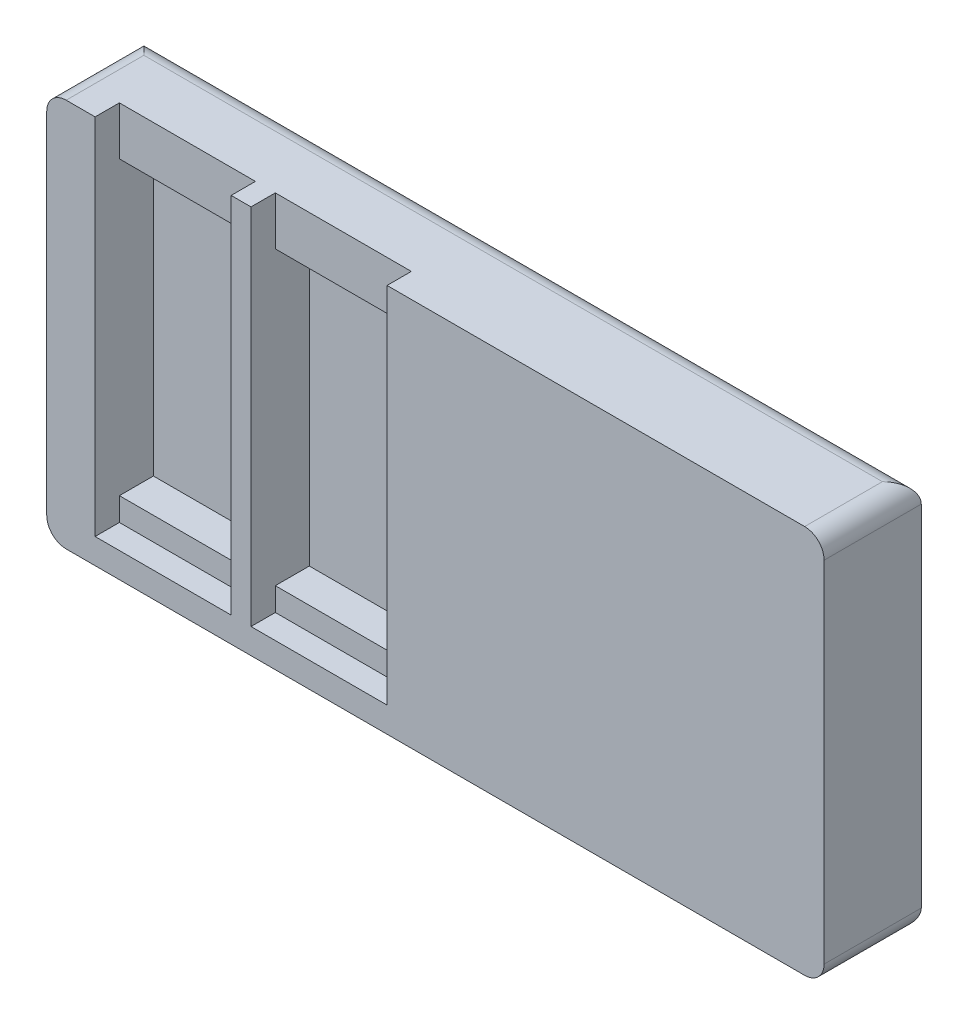
ISO-10303-21;
HEADER;
FILE_DESCRIPTION(('STEP AP214'),'2;1');
FILE_NAME('part.step','',(''),(''),'','','');
FILE_SCHEMA(('AUTOMOTIVE_DESIGN { 1 0 10303 214 1 1 1 1 }'));
ENDSEC;
DATA;
#1=APPLICATION_CONTEXT('core data for automotive mechanical design processes');
#2=APPLICATION_PROTOCOL_DEFINITION('international standard','automotive_design',2000,#1);
#3=PRODUCT_CONTEXT('',#1,'mechanical');
#4=PRODUCT('Part','Part','',(#3));
#5=PRODUCT_RELATED_PRODUCT_CATEGORY('part','',(#4));
#6=PRODUCT_DEFINITION_FORMATION('','',#4);
#7=PRODUCT_DEFINITION_CONTEXT('part definition',#1,'design');
#8=PRODUCT_DEFINITION('design','',#6,#7);
#9=PRODUCT_DEFINITION_SHAPE('','',#8);
#10=(LENGTH_UNIT() NAMED_UNIT(*) SI_UNIT(.MILLI.,.METRE.));
#11=(NAMED_UNIT(*) PLANE_ANGLE_UNIT() SI_UNIT($,.RADIAN.));
#12=(NAMED_UNIT(*) SI_UNIT($,.STERADIAN.) SOLID_ANGLE_UNIT());
#13=UNCERTAINTY_MEASURE_WITH_UNIT(LENGTH_MEASURE(1.E-05),#10,'distance_accuracy_value','');
#14=(GEOMETRIC_REPRESENTATION_CONTEXT(3) GLOBAL_UNCERTAINTY_ASSIGNED_CONTEXT((#13)) GLOBAL_UNIT_ASSIGNED_CONTEXT((#10,
#11,#12)) REPRESENTATION_CONTEXT('',''));
#15=CARTESIAN_POINT('',(0.,0.,0.));
#16=DIRECTION('',(0.,0.,1.));
#17=DIRECTION('',(1.,0.,0.));
#18=AXIS2_PLACEMENT_3D('',#15,#16,#17);
#19=CARTESIAN_POINT('',(0.,0.,-12.7));
#20=DIRECTION('',(0.,0.,1.));
#21=DIRECTION('',(1.,0.,0.));
#22=AXIS2_PLACEMENT_3D('',#19,#20,#21);
#23=PLANE('',#22);
#24=DIRECTION('',(-1.,0.,0.));
#25=VECTOR('',#24,1.);
#26=CARTESIAN_POINT('',(0.,50.8,-12.7));
#27=LINE('',#26,#25);
#28=CARTESIAN_POINT('',(99.06,50.8,-12.7));
#29=VERTEX_POINT('',#28);
#30=CARTESIAN_POINT('',(44.4788003448369,50.8,-12.7));
#31=VERTEX_POINT('',#30);
#32=EDGE_CURVE('E337',#29,#31,#27,.T.);
#33=ORIENTED_EDGE('',*,*,#32,.T.);
#34=DIRECTION('',(0.,-1.,0.));
#35=VECTOR('',#34,1.);
#36=CARTESIAN_POINT('',(44.478800344837,6.3388444270934,-12.7));
#37=LINE('',#36,#35);
#38=CARTESIAN_POINT('',(44.4788003448369,3.302,-12.7));
#39=VERTEX_POINT('',#38);
#40=EDGE_CURVE('E343',#31,#39,#37,.T.);
#41=ORIENTED_EDGE('',*,*,#40,.T.);
#42=DIRECTION('',(1.,0.,0.));
#43=VECTOR('',#42,1.);
#44=CARTESIAN_POINT('',(0.,3.302,-12.7));
#45=LINE('',#44,#43);
#46=CARTESIAN_POINT('',(26.698800344837,3.302,-12.7));
#47=VERTEX_POINT('',#46);
#48=EDGE_CURVE('E326',#47,#39,#45,.T.);
#49=ORIENTED_EDGE('',*,*,#48,.F.);
#50=DIRECTION('',(0.,1.,0.));
#51=VECTOR('',#50,1.);
#52=CARTESIAN_POINT('',(26.698800344837,6.33884442709341,-12.7));
#53=LINE('',#52,#51);
#54=CARTESIAN_POINT('',(26.698800344837,50.8,-12.7));
#55=VERTEX_POINT('',#54);
#56=EDGE_CURVE('E341',#47,#55,#53,.T.);
#57=ORIENTED_EDGE('',*,*,#56,.T.);
#58=CARTESIAN_POINT('',(24.1011996551631,50.8,-12.7));
#59=VERTEX_POINT('',#58);
#60=EDGE_CURVE('E227',#55,#59,#27,.T.);
#61=ORIENTED_EDGE('',*,*,#60,.T.);
#62=DIRECTION('',(0.,-1.,0.));
#63=VECTOR('',#62,1.);
#64=CARTESIAN_POINT('',(24.1011996551631,6.33884442709341,-12.7));
#65=LINE('',#64,#63);
#66=CARTESIAN_POINT('',(24.1011996551631,3.302,-12.7));
#67=VERTEX_POINT('',#66);
#68=EDGE_CURVE('E210',#59,#67,#65,.T.);
#69=ORIENTED_EDGE('',*,*,#68,.T.);
#70=DIRECTION('',(-1.,0.,0.));
#71=VECTOR('',#70,1.);
#72=CARTESIAN_POINT('',(0.,3.302,-12.7));
#73=LINE('',#72,#71);
#74=CARTESIAN_POINT('',(6.32119965516305,3.302,-12.7));
#75=VERTEX_POINT('',#74);
#76=EDGE_CURVE('E224',#67,#75,#73,.T.);
#77=ORIENTED_EDGE('',*,*,#76,.T.);
#78=DIRECTION('',(0.,1.,0.));
#79=VECTOR('',#78,1.);
#80=CARTESIAN_POINT('',(6.32119965516305,6.3388444270934,-12.7));
#81=LINE('',#80,#79);
#82=CARTESIAN_POINT('',(6.32119965516305,50.8,-12.7));
#83=VERTEX_POINT('',#82);
#84=EDGE_CURVE('E228',#75,#83,#81,.T.);
#85=ORIENTED_EDGE('',*,*,#84,.T.);
#86=CARTESIAN_POINT('',(2.54,50.8,-12.7));
#87=VERTEX_POINT('',#86);
#88=EDGE_CURVE('E338',#83,#87,#27,.T.);
#89=ORIENTED_EDGE('',*,*,#88,.T.);
#90=CARTESIAN_POINT('',(2.54,48.26,-12.7));
#91=DIRECTION('',(0.,0.,1.));
#92=DIRECTION('',(1.,0.,0.));
#93=AXIS2_PLACEMENT_3D('',#90,#91,#92);
#94=CIRCLE('',#93,2.54);
#95=CARTESIAN_POINT('',(0.,48.26,-12.7));
#96=VERTEX_POINT('',#95);
#97=EDGE_CURVE('E239',#96,#87,#94,.F.);
#98=ORIENTED_EDGE('',*,*,#97,.F.);
#99=DIRECTION('',(0.,-1.,0.));
#100=VECTOR('',#99,1.);
#101=CARTESIAN_POINT('',(0.,50.8,-12.7));
#102=LINE('',#101,#100);
#103=CARTESIAN_POINT('',(0.,2.54,-12.7));
#104=VERTEX_POINT('',#103);
#105=EDGE_CURVE('E331',#96,#104,#102,.T.);
#106=ORIENTED_EDGE('',*,*,#105,.T.);
#107=CARTESIAN_POINT('',(2.54,2.54,-12.7));
#108=DIRECTION('',(0.,0.,1.));
#109=DIRECTION('',(1.,0.,0.));
#110=AXIS2_PLACEMENT_3D('',#107,#108,#109);
#111=CIRCLE('',#110,2.54);
#112=CARTESIAN_POINT('',(2.54,0.,-12.7));
#113=VERTEX_POINT('',#112);
#114=EDGE_CURVE('E322',#113,#104,#111,.F.);
#115=ORIENTED_EDGE('',*,*,#114,.F.);
#116=DIRECTION('',(-1.,0.,0.));
#117=VECTOR('',#116,1.);
#118=CARTESIAN_POINT('',(0.,0.,-12.7));
#119=LINE('',#118,#117);
#120=CARTESIAN_POINT('',(99.06,0.,-12.7));
#121=VERTEX_POINT('',#120);
#122=EDGE_CURVE('E328',#121,#113,#119,.T.);
#123=ORIENTED_EDGE('',*,*,#122,.F.);
#124=CARTESIAN_POINT('',(99.06,2.54,-12.7));
#125=DIRECTION('',(0.,0.,1.));
#126=DIRECTION('',(1.,0.,0.));
#127=AXIS2_PLACEMENT_3D('',#124,#125,#126);
#128=CIRCLE('',#127,2.54);
#129=CARTESIAN_POINT('',(101.6,2.54,-12.7));
#130=VERTEX_POINT('',#129);
#131=EDGE_CURVE('E324',#130,#121,#128,.F.);
#132=ORIENTED_EDGE('',*,*,#131,.F.);
#133=DIRECTION('',(0.,1.,0.));
#134=VECTOR('',#133,1.);
#135=CARTESIAN_POINT('',(101.6,50.8,-12.7));
#136=LINE('',#135,#134);
#137=CARTESIAN_POINT('',(101.6,48.26,-12.7));
#138=VERTEX_POINT('',#137);
#139=EDGE_CURVE('E334',#130,#138,#136,.T.);
#140=ORIENTED_EDGE('',*,*,#139,.T.);
#141=CARTESIAN_POINT('',(99.06,48.26,-12.7));
#142=DIRECTION('',(0.,0.,1.));
#143=DIRECTION('',(1.,0.,0.));
#144=AXIS2_PLACEMENT_3D('',#141,#142,#143);
#145=CIRCLE('',#144,2.54);
#146=EDGE_CURVE('E320',#29,#138,#145,.F.);
#147=ORIENTED_EDGE('',*,*,#146,.F.);
#148=EDGE_LOOP('',(#33,#41,#49,#57,#61,#69,#77,#85,#89,#98,#106,#115,#123,#132,#140,#147));
#149=FACE_BOUND('',#148,.T.);
#150=ADVANCED_FACE('F37',(#149),#23,.T.);
#151=CARTESIAN_POINT('',(0.,50.8,-25.4));
#152=DIRECTION('',(0.,0.,1.));
#153=DIRECTION('',(1.,0.,0.));
#154=AXIS2_PLACEMENT_3D('',#151,#152,#153);
#155=PLANE('',#154);
#156=DIRECTION('',(0.,-1.,0.));
#157=VECTOR('',#156,1.);
#158=CARTESIAN_POINT('',(101.6,50.8,-25.4));
#159=LINE('',#158,#157);
#160=CARTESIAN_POINT('',(101.6,48.26,-25.4));
#161=VERTEX_POINT('',#160);
#162=CARTESIAN_POINT('',(101.6,2.54,-25.4));
#163=VERTEX_POINT('',#162);
#164=EDGE_CURVE('E378',#161,#163,#159,.T.);
#165=ORIENTED_EDGE('',*,*,#164,.T.);
#166=DIRECTION('',(-1.,0.,0.));
#167=VECTOR('',#166,1.);
#168=CARTESIAN_POINT('',(0.,2.54,-25.4));
#169=LINE('',#168,#167);
#170=CARTESIAN_POINT('',(0.,2.54,-25.4));
#171=VERTEX_POINT('',#170);
#172=EDGE_CURVE('E259',#163,#171,#169,.T.);
#173=ORIENTED_EDGE('',*,*,#172,.T.);
#174=DIRECTION('',(0.,-1.,0.));
#175=VECTOR('',#174,1.);
#176=CARTESIAN_POINT('',(0.,50.8,-25.4));
#177=LINE('',#176,#175);
#178=CARTESIAN_POINT('',(0.,48.26,-25.4));
#179=VERTEX_POINT('',#178);
#180=EDGE_CURVE('E264',#179,#171,#177,.T.);
#181=ORIENTED_EDGE('',*,*,#180,.F.);
#182=DIRECTION('',(-1.,0.,0.));
#183=VECTOR('',#182,1.);
#184=CARTESIAN_POINT('',(0.,48.26,-25.4));
#185=LINE('',#184,#183);
#186=EDGE_CURVE('E381',#179,#161,#185,.F.);
#187=ORIENTED_EDGE('',*,*,#186,.T.);
#188=EDGE_LOOP('',(#165,#173,#181,#187));
#189=FACE_BOUND('',#188,.T.);
#190=ADVANCED_FACE('F374',(#189),#155,.F.);
#191=CARTESIAN_POINT('',(26.698800344837,6.33884442709341,-20.32));
#192=DIRECTION('',(0.,-1.,0.));
#193=DIRECTION('',(1.,0.,0.));
#194=AXIS2_PLACEMENT_3D('',#191,#192,#193);
#195=PLANE('',#194);
#196=DIRECTION('',(0.,0.,1.));
#197=VECTOR('',#196,1.);
#198=CARTESIAN_POINT('',(26.698800344837,6.33884442709341,-20.32));
#199=LINE('',#198,#197);
#200=CARTESIAN_POINT('',(26.698800344837,6.33884442709341,-20.32));
#201=VERTEX_POINT('',#200);
#202=CARTESIAN_POINT('',(26.698800344837,6.33884442709341,-15.875));
#203=VERTEX_POINT('',#202);
#204=EDGE_CURVE('E282',#201,#203,#199,.T.);
#205=ORIENTED_EDGE('',*,*,#204,.T.);
#206=DIRECTION('',(1.,0.,0.));
#207=VECTOR('',#206,1.);
#208=CARTESIAN_POINT('',(26.698800344837,6.33884442709341,-15.875));
#209=LINE('',#208,#207);
#210=CARTESIAN_POINT('',(44.478800344837,6.3388444270934,-15.875));
#211=VERTEX_POINT('',#210);
#212=EDGE_CURVE('E383',#203,#211,#209,.T.);
#213=ORIENTED_EDGE('',*,*,#212,.T.);
#214=DIRECTION('',(0.,0.,1.));
#215=VECTOR('',#214,1.);
#216=CARTESIAN_POINT('',(44.478800344837,6.3388444270934,-20.32));
#217=LINE('',#216,#215);
#218=CARTESIAN_POINT('',(44.478800344837,6.3388444270934,-20.32));
#219=VERTEX_POINT('',#218);
#220=EDGE_CURVE('E279',#219,#211,#217,.T.);
#221=ORIENTED_EDGE('',*,*,#220,.F.);
#222=DIRECTION('',(1.,0.,0.));
#223=VECTOR('',#222,1.);
#224=CARTESIAN_POINT('',(26.698800344837,6.33884442709341,-20.32));
#225=LINE('',#224,#223);
#226=EDGE_CURVE('E398',#201,#219,#225,.T.);
#227=ORIENTED_EDGE('',*,*,#226,.F.);
#228=EDGE_LOOP('',(#205,#213,#221,#227));
#229=FACE_BOUND('',#228,.T.);
#230=ADVANCED_FACE('F427',(#229),#195,.F.);
#231=CARTESIAN_POINT('',(0.,0.,-20.32));
#232=DIRECTION('',(0.,0.,-1.));
#233=DIRECTION('',(-1.,0.,0.));
#234=AXIS2_PLACEMENT_3D('',#231,#232,#233);
#235=PLANE('',#234);
#236=DIRECTION('',(0.,-1.,0.));
#237=VECTOR('',#236,1.);
#238=CARTESIAN_POINT('',(26.698800344837,6.33884442709341,-20.32));
#239=LINE('',#238,#237);
#240=CARTESIAN_POINT('',(26.698800344837,44.4611555729066,-20.32));
#241=VERTEX_POINT('',#240);
#242=EDGE_CURVE('E401',#241,#201,#239,.T.);
#243=ORIENTED_EDGE('',*,*,#242,.T.);
#244=ORIENTED_EDGE('',*,*,#226,.T.);
#245=DIRECTION('',(0.,1.,0.));
#246=VECTOR('',#245,1.);
#247=CARTESIAN_POINT('',(44.478800344837,6.3388444270934,-20.32));
#248=LINE('',#247,#246);
#249=CARTESIAN_POINT('',(44.478800344837,44.4611555729066,-20.32));
#250=VERTEX_POINT('',#249);
#251=EDGE_CURVE('E395',#219,#250,#248,.T.);
#252=ORIENTED_EDGE('',*,*,#251,.T.);
#253=DIRECTION('',(-1.,0.,0.));
#254=VECTOR('',#253,1.);
#255=CARTESIAN_POINT('',(26.698800344837,44.4611555729066,-20.32));
#256=LINE('',#255,#254);
#257=EDGE_CURVE('E285',#250,#241,#256,.T.);
#258=ORIENTED_EDGE('',*,*,#257,.T.);
#259=EDGE_LOOP('',(#243,#244,#252,#258));
#260=FACE_BOUND('',#259,.T.);
#261=ADVANCED_FACE('F430',(#260),#235,.F.);
#262=CARTESIAN_POINT('',(26.698800344837,44.4611555729066,-20.32));
#263=DIRECTION('',(0.,1.,0.));
#264=DIRECTION('',(0.,0.,1.));
#265=AXIS2_PLACEMENT_3D('',#262,#263,#264);
#266=PLANE('',#265);
#267=DIRECTION('',(0.,0.,1.));
#268=VECTOR('',#267,1.);
#269=CARTESIAN_POINT('',(44.478800344837,44.4611555729066,-20.32));
#270=LINE('',#269,#268);
#271=CARTESIAN_POINT('',(44.4788003448369,44.4611555729066,-15.875));
#272=VERTEX_POINT('',#271);
#273=EDGE_CURVE('E275',#250,#272,#270,.T.);
#274=ORIENTED_EDGE('',*,*,#273,.T.);
#275=DIRECTION('',(-1.,0.,0.));
#276=VECTOR('',#275,1.);
#277=CARTESIAN_POINT('',(26.698800344837,44.4611555729066,-15.875));
#278=LINE('',#277,#276);
#279=CARTESIAN_POINT('',(26.698800344837,44.4611555729066,-15.875));
#280=VERTEX_POINT('',#279);
#281=EDGE_CURVE('E404',#272,#280,#278,.T.);
#282=ORIENTED_EDGE('',*,*,#281,.T.);
#283=DIRECTION('',(0.,0.,1.));
#284=VECTOR('',#283,1.);
#285=CARTESIAN_POINT('',(26.698800344837,44.4611555729066,-20.32));
#286=LINE('',#285,#284);
#287=EDGE_CURVE('E273',#241,#280,#286,.T.);
#288=ORIENTED_EDGE('',*,*,#287,.F.);
#289=ORIENTED_EDGE('',*,*,#257,.F.);
#290=EDGE_LOOP('',(#274,#282,#288,#289));
#291=FACE_BOUND('',#290,.T.);
#292=ADVANCED_FACE('F433',(#291),#266,.F.);
#293=CARTESIAN_POINT('',(44.4788003448369,3.302,-15.875));
#294=DIRECTION('',(0.,0.,-1.));
#295=DIRECTION('',(-1.,0.,0.));
#296=AXIS2_PLACEMENT_3D('',#293,#294,#295);
#297=PLANE('',#296);
#298=DIRECTION('',(0.,1.,0.));
#299=VECTOR('',#298,1.);
#300=CARTESIAN_POINT('',(44.4788003448369,3.302,-15.875));
#301=LINE('',#300,#299);
#302=CARTESIAN_POINT('',(44.4788003448369,50.8,-15.875));
#303=VERTEX_POINT('',#302);
#304=EDGE_CURVE('E297',#272,#303,#301,.T.);
#305=ORIENTED_EDGE('',*,*,#304,.T.);
#306=DIRECTION('',(-1.,0.,0.));
#307=VECTOR('',#306,1.);
#308=CARTESIAN_POINT('',(44.4788003448369,50.8,-15.875));
#309=LINE('',#308,#307);
#310=CARTESIAN_POINT('',(26.698800344837,50.8,-15.875));
#311=VERTEX_POINT('',#310);
#312=EDGE_CURVE('E300',#303,#311,#309,.T.);
#313=ORIENTED_EDGE('',*,*,#312,.T.);
#314=DIRECTION('',(0.,1.,0.));
#315=VECTOR('',#314,1.);
#316=CARTESIAN_POINT('',(26.698800344837,3.302,-15.875));
#317=LINE('',#316,#315);
#318=EDGE_CURVE('E56',#280,#311,#317,.T.);
#319=ORIENTED_EDGE('',*,*,#318,.F.);
#320=ORIENTED_EDGE('',*,*,#281,.F.);
#321=EDGE_LOOP('',(#305,#313,#319,#320));
#322=FACE_BOUND('',#321,.T.);
#323=ADVANCED_FACE('F435',(#322),#297,.F.);
#324=CARTESIAN_POINT('',(24.1011996551631,6.33884442709341,-20.32));
#325=DIRECTION('',(0.,-1.,0.));
#326=DIRECTION('',(1.,0.,0.));
#327=AXIS2_PLACEMENT_3D('',#324,#325,#326);
#328=PLANE('',#327);
#329=DIRECTION('',(0.,0.,1.));
#330=VECTOR('',#329,1.);
#331=CARTESIAN_POINT('',(6.32119965516305,6.3388444270934,-20.32));
#332=LINE('',#331,#330);
#333=CARTESIAN_POINT('',(6.32119965516305,6.3388444270934,-20.32));
#334=VERTEX_POINT('',#333);
#335=CARTESIAN_POINT('',(6.32119965516305,6.33884442709341,-15.875));
#336=VERTEX_POINT('',#335);
#337=EDGE_CURVE('E269',#334,#336,#332,.T.);
#338=ORIENTED_EDGE('',*,*,#337,.T.);
#339=DIRECTION('',(1.,0.,0.));
#340=VECTOR('',#339,1.);
#341=CARTESIAN_POINT('',(24.1011996551631,6.33884442709341,-15.875));
#342=LINE('',#341,#340);
#343=CARTESIAN_POINT('',(24.1011996551631,6.33884442709341,-15.875));
#344=VERTEX_POINT('',#343);
#345=EDGE_CURVE('E89',#336,#344,#342,.T.);
#346=ORIENTED_EDGE('',*,*,#345,.T.);
#347=DIRECTION('',(0.,0.,1.));
#348=VECTOR('',#347,1.);
#349=CARTESIAN_POINT('',(24.1011996551631,6.33884442709341,-20.32));
#350=LINE('',#349,#348);
#351=CARTESIAN_POINT('',(24.1011996551631,6.33884442709341,-20.32));
#352=VERTEX_POINT('',#351);
#353=EDGE_CURVE('E267',#352,#344,#350,.T.);
#354=ORIENTED_EDGE('',*,*,#353,.F.);
#355=DIRECTION('',(1.,0.,0.));
#356=VECTOR('',#355,1.);
#357=CARTESIAN_POINT('',(24.1011996551631,6.33884442709341,-20.32));
#358=LINE('',#357,#356);
#359=EDGE_CURVE('E410',#334,#352,#358,.T.);
#360=ORIENTED_EDGE('',*,*,#359,.F.);
#361=EDGE_LOOP('',(#338,#346,#354,#360));
#362=FACE_BOUND('',#361,.T.);
#363=ADVANCED_FACE('F490',(#362),#328,.F.);
#364=CARTESIAN_POINT('',(0.,0.,-20.32));
#365=DIRECTION('',(0.,0.,1.));
#366=DIRECTION('',(1.,0.,0.));
#367=AXIS2_PLACEMENT_3D('',#364,#365,#366);
#368=PLANE('',#367);
#369=DIRECTION('',(0.,-1.,0.));
#370=VECTOR('',#369,1.);
#371=CARTESIAN_POINT('',(6.32119965516305,6.3388444270934,-20.32));
#372=LINE('',#371,#370);
#373=CARTESIAN_POINT('',(6.32119965516305,44.4611555729066,-20.32));
#374=VERTEX_POINT('',#373);
#375=EDGE_CURVE('E276',#374,#334,#372,.T.);
#376=ORIENTED_EDGE('',*,*,#375,.T.);
#377=ORIENTED_EDGE('',*,*,#359,.T.);
#378=DIRECTION('',(0.,1.,0.));
#379=VECTOR('',#378,1.);
#380=CARTESIAN_POINT('',(24.1011996551631,6.33884442709341,-20.32));
#381=LINE('',#380,#379);
#382=CARTESIAN_POINT('',(24.1011996551631,44.4611555729066,-20.32));
#383=VERTEX_POINT('',#382);
#384=EDGE_CURVE('E407',#352,#383,#381,.T.);
#385=ORIENTED_EDGE('',*,*,#384,.T.);
#386=DIRECTION('',(-1.,0.,0.));
#387=VECTOR('',#386,1.);
#388=CARTESIAN_POINT('',(24.1011996551631,44.4611555729066,-20.32));
#389=LINE('',#388,#387);
#390=EDGE_CURVE('E272',#383,#374,#389,.T.);
#391=ORIENTED_EDGE('',*,*,#390,.T.);
#392=EDGE_LOOP('',(#376,#377,#385,#391));
#393=FACE_BOUND('',#392,.T.);
#394=ADVANCED_FACE('F486',(#393),#368,.T.);
#395=CARTESIAN_POINT('',(24.1011996551631,44.4611555729066,-20.32));
#396=DIRECTION('',(0.,1.,0.));
#397=DIRECTION('',(0.,0.,1.));
#398=AXIS2_PLACEMENT_3D('',#395,#396,#397);
#399=PLANE('',#398);
#400=DIRECTION('',(0.,0.,1.));
#401=VECTOR('',#400,1.);
#402=CARTESIAN_POINT('',(24.1011996551631,44.4611555729066,-20.32));
#403=LINE('',#402,#401);
#404=CARTESIAN_POINT('',(24.1011996551631,44.4611555729066,-15.875));
#405=VERTEX_POINT('',#404);
#406=EDGE_CURVE('E263',#383,#405,#403,.T.);
#407=ORIENTED_EDGE('',*,*,#406,.T.);
#408=DIRECTION('',(-1.,0.,0.));
#409=VECTOR('',#408,1.);
#410=CARTESIAN_POINT('',(24.1011996551631,44.4611555729066,-15.875));
#411=LINE('',#410,#409);
#412=CARTESIAN_POINT('',(6.32119965516305,44.4611555729066,-15.875));
#413=VERTEX_POINT('',#412);
#414=EDGE_CURVE('E84',#405,#413,#411,.T.);
#415=ORIENTED_EDGE('',*,*,#414,.T.);
#416=DIRECTION('',(0.,0.,1.));
#417=VECTOR('',#416,1.);
#418=CARTESIAN_POINT('',(6.32119965516305,44.4611555729066,-20.32));
#419=LINE('',#418,#417);
#420=EDGE_CURVE('E260',#374,#413,#419,.T.);
#421=ORIENTED_EDGE('',*,*,#420,.F.);
#422=ORIENTED_EDGE('',*,*,#390,.F.);
#423=EDGE_LOOP('',(#407,#415,#421,#422));
#424=FACE_BOUND('',#423,.T.);
#425=ADVANCED_FACE('F489',(#424),#399,.F.);
#426=CARTESIAN_POINT('',(6.32119965516305,3.302,-15.875));
#427=DIRECTION('',(0.,0.,-1.));
#428=DIRECTION('',(-1.,0.,0.));
#429=AXIS2_PLACEMENT_3D('',#426,#427,#428);
#430=PLANE('',#429);
#431=DIRECTION('',(0.,1.,0.));
#432=VECTOR('',#431,1.);
#433=CARTESIAN_POINT('',(24.1011996551631,3.302,-15.875));
#434=LINE('',#433,#432);
#435=CARTESIAN_POINT('',(24.1011996551631,50.8,-15.875));
#436=VERTEX_POINT('',#435);
#437=EDGE_CURVE('E286',#405,#436,#434,.T.);
#438=ORIENTED_EDGE('',*,*,#437,.T.);
#439=DIRECTION('',(-1.,0.,0.));
#440=VECTOR('',#439,1.);
#441=CARTESIAN_POINT('',(6.32119965516305,50.8,-15.875));
#442=LINE('',#441,#440);
#443=CARTESIAN_POINT('',(6.32119965516305,50.8,-15.875));
#444=VERTEX_POINT('',#443);
#445=EDGE_CURVE('E289',#436,#444,#442,.T.);
#446=ORIENTED_EDGE('',*,*,#445,.T.);
#447=DIRECTION('',(0.,1.,0.));
#448=VECTOR('',#447,1.);
#449=CARTESIAN_POINT('',(6.32119965516305,3.302,-15.875));
#450=LINE('',#449,#448);
#451=EDGE_CURVE('E314',#413,#444,#450,.T.);
#452=ORIENTED_EDGE('',*,*,#451,.F.);
#453=ORIENTED_EDGE('',*,*,#414,.F.);
#454=EDGE_LOOP('',(#438,#446,#452,#453));
#455=FACE_BOUND('',#454,.T.);
#456=ADVANCED_FACE('F470',(#455),#430,.F.);
#457=CARTESIAN_POINT('',(0.,2.54,-22.86));
#458=DIRECTION('',(1.,0.,0.));
#459=DIRECTION('',(0.,0.,-1.));
#460=AXIS2_PLACEMENT_3D('',#457,#458,#459);
#461=CYLINDRICAL_SURFACE('',#460,2.54);
#462=CARTESIAN_POINT('',(99.06,2.54,-22.86));
#463=DIRECTION('',(0.707106781186548,0.,0.707106781186547));
#464=DIRECTION('',(-0.707106781186547,0.,0.707106781186548));
#465=AXIS2_PLACEMENT_3D('',#462,#463,#464);
#466=ELLIPSE('',#465,3.59210244842766,2.54);
#467=CARTESIAN_POINT('',(99.06,0.,-22.86));
#468=VERTEX_POINT('',#467);
#469=EDGE_CURVE('E307',#163,#468,#466,.F.);
#470=ORIENTED_EDGE('',*,*,#469,.T.);
#471=DIRECTION('',(-1.,0.,0.));
#472=VECTOR('',#471,1.);
#473=CARTESIAN_POINT('',(101.6,0.,-22.86));
#474=LINE('',#473,#472);
#475=CARTESIAN_POINT('',(2.54,0.,-22.86));
#476=VERTEX_POINT('',#475);
#477=EDGE_CURVE('E253',#476,#468,#474,.F.);
#478=ORIENTED_EDGE('',*,*,#477,.F.);
#479=CARTESIAN_POINT('',(2.54,2.54,-22.86));
#480=DIRECTION('',(0.707106781186547,0.,-0.707106781186547));
#481=DIRECTION('',(-0.707106781186547,0.,-0.707106781186547));
#482=AXIS2_PLACEMENT_3D('',#479,#480,#481);
#483=ELLIPSE('',#482,3.59210244842766,2.54);
#484=EDGE_CURVE('E370',#476,#171,#483,.T.);
#485=ORIENTED_EDGE('',*,*,#484,.T.);
#486=ORIENTED_EDGE('',*,*,#172,.F.);
#487=EDGE_LOOP('',(#470,#478,#485,#486));
#488=FACE_BOUND('',#487,.T.);
#489=ADVANCED_FACE('F453',(#488),#461,.T.);
#490=CARTESIAN_POINT('',(101.6,50.8,0.));
#491=DIRECTION('',(-1.,0.,0.));
#492=DIRECTION('',(0.,0.,1.));
#493=AXIS2_PLACEMENT_3D('',#490,#491,#492);
#494=PLANE('',#493);
#495=ORIENTED_EDGE('',*,*,#139,.F.);
#496=DIRECTION('',(0.,0.,-1.));
#497=VECTOR('',#496,1.);
#498=CARTESIAN_POINT('',(101.6,2.54,-25.4));
#499=LINE('',#498,#497);
#500=EDGE_CURVE('E245',#130,#163,#499,.T.);
#501=ORIENTED_EDGE('',*,*,#500,.T.);
#502=ORIENTED_EDGE('',*,*,#164,.F.);
#503=DIRECTION('',(0.,0.,-1.));
#504=VECTOR('',#503,1.);
#505=CARTESIAN_POINT('',(101.6,48.26,0.));
#506=LINE('',#505,#504);
#507=EDGE_CURVE('E242',#161,#138,#506,.F.);
#508=ORIENTED_EDGE('',*,*,#507,.T.);
#509=EDGE_LOOP('',(#495,#501,#502,#508));
#510=FACE_BOUND('',#509,.T.);
#511=ADVANCED_FACE('F462',(#510),#494,.F.);
#512=CARTESIAN_POINT('',(0.,48.26,-22.86));
#513=DIRECTION('',(-1.,0.,0.));
#514=DIRECTION('',(0.,0.,1.));
#515=AXIS2_PLACEMENT_3D('',#512,#513,#514);
#516=CYLINDRICAL_SURFACE('',#515,2.54);
#517=CARTESIAN_POINT('',(99.06,48.26,-22.86));
#518=DIRECTION('',(-0.707106781186548,0.,-0.707106781186547));
#519=DIRECTION('',(0.707106781186547,0.,-0.707106781186548));
#520=AXIS2_PLACEMENT_3D('',#517,#518,#519);
#521=ELLIPSE('',#520,3.59210244842766,2.54);
#522=CARTESIAN_POINT('',(99.06,50.8,-22.86));
#523=VERTEX_POINT('',#522);
#524=EDGE_CURVE('E47',#523,#161,#521,.T.);
#525=ORIENTED_EDGE('',*,*,#524,.T.);
#526=ORIENTED_EDGE('',*,*,#186,.F.);
#527=CARTESIAN_POINT('',(2.54,48.26,-22.86));
#528=DIRECTION('',(-0.707106781186547,0.,0.707106781186547));
#529=DIRECTION('',(0.707106781186547,0.,0.707106781186547));
#530=AXIS2_PLACEMENT_3D('',#527,#528,#529);
#531=ELLIPSE('',#530,3.59210244842766,2.54);
#532=CARTESIAN_POINT('',(2.54,50.8,-22.86));
#533=VERTEX_POINT('',#532);
#534=EDGE_CURVE('E11',#179,#533,#531,.F.);
#535=ORIENTED_EDGE('',*,*,#534,.T.);
#536=DIRECTION('',(-1.,0.,0.));
#537=VECTOR('',#536,1.);
#538=CARTESIAN_POINT('',(0.,50.8,-22.86));
#539=LINE('',#538,#537);
#540=EDGE_CURVE('E247',#523,#533,#539,.T.);
#541=ORIENTED_EDGE('',*,*,#540,.F.);
#542=EDGE_LOOP('',(#525,#526,#535,#541));
#543=FACE_BOUND('',#542,.T.);
#544=ADVANCED_FACE('F448',(#543),#516,.T.);
#545=CARTESIAN_POINT('',(0.,50.8,0.));
#546=DIRECTION('',(0.,-1.,0.));
#547=DIRECTION('',(0.,0.,-1.));
#548=AXIS2_PLACEMENT_3D('',#545,#546,#547);
#549=PLANE('',#548);
#550=ORIENTED_EDGE('',*,*,#32,.F.);
#551=DIRECTION('',(0.,0.,-1.));
#552=VECTOR('',#551,1.);
#553=CARTESIAN_POINT('',(99.06,50.8,0.));
#554=LINE('',#553,#552);
#555=EDGE_CURVE('E248',#29,#523,#554,.T.);
#556=ORIENTED_EDGE('',*,*,#555,.T.);
#557=ORIENTED_EDGE('',*,*,#540,.T.);
#558=DIRECTION('',(0.,0.,1.));
#559=VECTOR('',#558,1.);
#560=CARTESIAN_POINT('',(2.54,50.8,0.));
#561=LINE('',#560,#559);
#562=EDGE_CURVE('E250',#533,#87,#561,.T.);
#563=ORIENTED_EDGE('',*,*,#562,.T.);
#564=ORIENTED_EDGE('',*,*,#88,.F.);
#565=DIRECTION('',(0.,0.,1.));
#566=VECTOR('',#565,1.);
#567=CARTESIAN_POINT('',(6.32119965516305,50.8,-9.525));
#568=LINE('',#567,#566);
#569=EDGE_CURVE('E216',#444,#83,#568,.T.);
#570=ORIENTED_EDGE('',*,*,#569,.F.);
#571=ORIENTED_EDGE('',*,*,#445,.F.);
#572=DIRECTION('',(0.,0.,-1.));
#573=VECTOR('',#572,1.);
#574=CARTESIAN_POINT('',(24.1011996551631,50.8,-9.525));
#575=LINE('',#574,#573);
#576=EDGE_CURVE('E290',#59,#436,#575,.T.);
#577=ORIENTED_EDGE('',*,*,#576,.F.);
#578=ORIENTED_EDGE('',*,*,#60,.F.);
#579=DIRECTION('',(0.,0.,1.));
#580=VECTOR('',#579,1.);
#581=CARTESIAN_POINT('',(26.698800344837,50.8,-9.525));
#582=LINE('',#581,#580);
#583=EDGE_CURVE('E299',#311,#55,#582,.T.);
#584=ORIENTED_EDGE('',*,*,#583,.F.);
#585=ORIENTED_EDGE('',*,*,#312,.F.);
#586=DIRECTION('',(0.,0.,-1.));
#587=VECTOR('',#586,1.);
#588=CARTESIAN_POINT('',(44.4788003448369,50.8,-9.52500000000001));
#589=LINE('',#588,#587);
#590=EDGE_CURVE('E41',#31,#303,#589,.T.);
#591=ORIENTED_EDGE('',*,*,#590,.F.);
#592=EDGE_LOOP('',(#550,#556,#557,#563,#564,#570,#571,#577,#578,#584,#585,#591));
#593=FACE_BOUND('',#592,.T.);
#594=ADVANCED_FACE('F352',(#593),#549,.F.);
#595=CARTESIAN_POINT('',(0.,50.8,0.));
#596=DIRECTION('',(1.,0.,0.));
#597=DIRECTION('',(0.,0.,-1.));
#598=AXIS2_PLACEMENT_3D('',#595,#596,#597);
#599=PLANE('',#598);
#600=ORIENTED_EDGE('',*,*,#105,.F.);
#601=DIRECTION('',(0.,0.,1.));
#602=VECTOR('',#601,1.);
#603=CARTESIAN_POINT('',(0.,48.26,0.));
#604=LINE('',#603,#602);
#605=EDGE_CURVE('E236',#96,#179,#604,.F.);
#606=ORIENTED_EDGE('',*,*,#605,.T.);
#607=ORIENTED_EDGE('',*,*,#180,.T.);
#608=DIRECTION('',(0.,0.,1.));
#609=VECTOR('',#608,1.);
#610=CARTESIAN_POINT('',(0.,2.54,0.));
#611=LINE('',#610,#609);
#612=EDGE_CURVE('E238',#171,#104,#611,.T.);
#613=ORIENTED_EDGE('',*,*,#612,.T.);
#614=EDGE_LOOP('',(#600,#606,#607,#613));
#615=FACE_BOUND('',#614,.T.);
#616=ADVANCED_FACE('F361',(#615),#599,.F.);
#617=CARTESIAN_POINT('',(2.54,48.26,0.));
#618=DIRECTION('',(0.,0.,1.));
#619=DIRECTION('',(1.,0.,0.));
#620=AXIS2_PLACEMENT_3D('',#617,#618,#619);
#621=CYLINDRICAL_SURFACE('',#620,2.54);
#622=ORIENTED_EDGE('',*,*,#605,.F.);
#623=ORIENTED_EDGE('',*,*,#97,.T.);
#624=ORIENTED_EDGE('',*,*,#562,.F.);
#625=ORIENTED_EDGE('',*,*,#534,.F.);
#626=EDGE_LOOP('',(#622,#623,#624,#625));
#627=FACE_BOUND('',#626,.T.);
#628=ADVANCED_FACE('F39',(#627),#621,.T.);
#629=CARTESIAN_POINT('',(99.06,48.26,0.));
#630=DIRECTION('',(0.,0.,-1.));
#631=DIRECTION('',(-1.,0.,0.));
#632=AXIS2_PLACEMENT_3D('',#629,#630,#631);
#633=CYLINDRICAL_SURFACE('',#632,2.54);
#634=ORIENTED_EDGE('',*,*,#555,.F.);
#635=ORIENTED_EDGE('',*,*,#146,.T.);
#636=ORIENTED_EDGE('',*,*,#507,.F.);
#637=ORIENTED_EDGE('',*,*,#524,.F.);
#638=EDGE_LOOP('',(#634,#635,#636,#637));
#639=FACE_BOUND('',#638,.T.);
#640=ADVANCED_FACE('F444',(#639),#633,.T.);
#641=CARTESIAN_POINT('',(0.,0.,0.));
#642=DIRECTION('',(0.,-1.,0.));
#643=DIRECTION('',(0.,0.,-1.));
#644=AXIS2_PLACEMENT_3D('',#641,#642,#643);
#645=PLANE('',#644);
#646=DIRECTION('',(0.,0.,-1.));
#647=VECTOR('',#646,1.);
#648=CARTESIAN_POINT('',(99.06,0.,0.));
#649=LINE('',#648,#647);
#650=EDGE_CURVE('E254',#468,#121,#649,.F.);
#651=ORIENTED_EDGE('',*,*,#650,.T.);
#652=ORIENTED_EDGE('',*,*,#122,.T.);
#653=DIRECTION('',(0.,0.,1.));
#654=VECTOR('',#653,1.);
#655=CARTESIAN_POINT('',(2.54,0.,-25.4));
#656=LINE('',#655,#654);
#657=EDGE_CURVE('E257',#113,#476,#656,.F.);
#658=ORIENTED_EDGE('',*,*,#657,.T.);
#659=ORIENTED_EDGE('',*,*,#477,.T.);
#660=EDGE_LOOP('',(#651,#652,#658,#659));
#661=FACE_BOUND('',#660,.T.);
#662=ADVANCED_FACE('F460',(#661),#645,.T.);
#663=CARTESIAN_POINT('',(2.54,2.54,0.));
#664=DIRECTION('',(0.,0.,-1.));
#665=DIRECTION('',(-1.,0.,0.));
#666=AXIS2_PLACEMENT_3D('',#663,#664,#665);
#667=CYLINDRICAL_SURFACE('',#666,2.54);
#668=ORIENTED_EDGE('',*,*,#657,.F.);
#669=ORIENTED_EDGE('',*,*,#114,.T.);
#670=ORIENTED_EDGE('',*,*,#612,.F.);
#671=ORIENTED_EDGE('',*,*,#484,.F.);
#672=EDGE_LOOP('',(#668,#669,#670,#671));
#673=FACE_BOUND('',#672,.T.);
#674=ADVANCED_FACE('F369',(#673),#667,.T.);
#675=CARTESIAN_POINT('',(99.06,2.54,0.));
#676=DIRECTION('',(0.,0.,1.));
#677=DIRECTION('',(1.,0.,0.));
#678=AXIS2_PLACEMENT_3D('',#675,#676,#677);
#679=CYLINDRICAL_SURFACE('',#678,2.54);
#680=ORIENTED_EDGE('',*,*,#500,.F.);
#681=ORIENTED_EDGE('',*,*,#131,.T.);
#682=ORIENTED_EDGE('',*,*,#650,.F.);
#683=ORIENTED_EDGE('',*,*,#469,.F.);
#684=EDGE_LOOP('',(#680,#681,#682,#683));
#685=FACE_BOUND('',#684,.T.);
#686=ADVANCED_FACE('F457',(#685),#679,.T.);
#687=CARTESIAN_POINT('',(6.32119965516305,6.3388444270934,-20.32));
#688=DIRECTION('',(-1.,0.,0.));
#689=DIRECTION('',(0.,-1.,0.));
#690=AXIS2_PLACEMENT_3D('',#687,#688,#689);
#691=PLANE('',#690);
#692=ORIENTED_EDGE('',*,*,#84,.F.);
#693=DIRECTION('',(0.,0.,1.));
#694=VECTOR('',#693,1.);
#695=CARTESIAN_POINT('',(6.32119965516305,3.302,-9.525));
#696=LINE('',#695,#694);
#697=CARTESIAN_POINT('',(6.32119965516305,3.302,-15.875));
#698=VERTEX_POINT('',#697);
#699=EDGE_CURVE('E231',#698,#75,#696,.T.);
#700=ORIENTED_EDGE('',*,*,#699,.F.);
#701=EDGE_CURVE('E75',#698,#336,#450,.T.);
#702=ORIENTED_EDGE('',*,*,#701,.T.);
#703=ORIENTED_EDGE('',*,*,#337,.F.);
#704=ORIENTED_EDGE('',*,*,#375,.F.);
#705=ORIENTED_EDGE('',*,*,#420,.T.);
#706=ORIENTED_EDGE('',*,*,#451,.T.);
#707=ORIENTED_EDGE('',*,*,#569,.T.);
#708=EDGE_LOOP('',(#692,#700,#702,#703,#704,#705,#706,#707));
#709=FACE_BOUND('',#708,.T.);
#710=ADVANCED_FACE('F347',(#709),#691,.F.);
#711=ORIENTED_EDGE('',*,*,#701,.F.);
#712=DIRECTION('',(-1.,0.,0.));
#713=VECTOR('',#712,1.);
#714=CARTESIAN_POINT('',(6.32119965516305,3.302,-15.875));
#715=LINE('',#714,#713);
#716=CARTESIAN_POINT('',(24.1011996551631,3.302,-15.875));
#717=VERTEX_POINT('',#716);
#718=EDGE_CURVE('E217',#717,#698,#715,.T.);
#719=ORIENTED_EDGE('',*,*,#718,.F.);
#720=EDGE_CURVE('E212',#717,#344,#434,.T.);
#721=ORIENTED_EDGE('',*,*,#720,.T.);
#722=ORIENTED_EDGE('',*,*,#345,.F.);
#723=EDGE_LOOP('',(#711,#719,#721,#722));
#724=FACE_BOUND('',#723,.T.);
#725=ADVANCED_FACE('F496',(#724),#430,.F.);
#726=CARTESIAN_POINT('',(24.1011996551631,6.33884442709341,-20.32));
#727=DIRECTION('',(1.,0.,0.));
#728=DIRECTION('',(0.,0.,-1.));
#729=AXIS2_PLACEMENT_3D('',#726,#727,#728);
#730=PLANE('',#729);
#731=ORIENTED_EDGE('',*,*,#68,.F.);
#732=ORIENTED_EDGE('',*,*,#576,.T.);
#733=ORIENTED_EDGE('',*,*,#437,.F.);
#734=ORIENTED_EDGE('',*,*,#406,.F.);
#735=ORIENTED_EDGE('',*,*,#384,.F.);
#736=ORIENTED_EDGE('',*,*,#353,.T.);
#737=ORIENTED_EDGE('',*,*,#720,.F.);
#738=DIRECTION('',(0.,0.,-1.));
#739=VECTOR('',#738,1.);
#740=CARTESIAN_POINT('',(24.1011996551631,3.302,-9.525));
#741=LINE('',#740,#739);
#742=EDGE_CURVE('E207',#67,#717,#741,.T.);
#743=ORIENTED_EDGE('',*,*,#742,.F.);
#744=EDGE_LOOP('',(#731,#732,#733,#734,#735,#736,#737,#743));
#745=FACE_BOUND('',#744,.T.);
#746=ADVANCED_FACE('F209',(#745),#730,.F.);
#747=CARTESIAN_POINT('',(0.,3.302,0.));
#748=DIRECTION('',(0.,-1.,0.));
#749=DIRECTION('',(0.,0.,-1.));
#750=AXIS2_PLACEMENT_3D('',#747,#748,#749);
#751=PLANE('',#750);
#752=ORIENTED_EDGE('',*,*,#76,.F.);
#753=ORIENTED_EDGE('',*,*,#742,.T.);
#754=ORIENTED_EDGE('',*,*,#718,.T.);
#755=ORIENTED_EDGE('',*,*,#699,.T.);
#756=EDGE_LOOP('',(#752,#753,#754,#755));
#757=FACE_BOUND('',#756,.T.);
#758=ADVANCED_FACE('F230',(#757),#751,.F.);
#759=CARTESIAN_POINT('',(26.698800344837,3.302,-15.875));
#760=VERTEX_POINT('',#759);
#761=EDGE_CURVE('E292',#760,#203,#317,.T.);
#762=ORIENTED_EDGE('',*,*,#761,.F.);
#763=DIRECTION('',(-1.,0.,0.));
#764=VECTOR('',#763,1.);
#765=CARTESIAN_POINT('',(44.4788003448369,3.302,-15.875));
#766=LINE('',#765,#764);
#767=CARTESIAN_POINT('',(44.4788003448369,3.302,-15.875));
#768=VERTEX_POINT('',#767);
#769=EDGE_CURVE('E296',#768,#760,#766,.T.);
#770=ORIENTED_EDGE('',*,*,#769,.F.);
#771=EDGE_CURVE('E417',#768,#211,#301,.T.);
#772=ORIENTED_EDGE('',*,*,#771,.T.);
#773=ORIENTED_EDGE('',*,*,#212,.F.);
#774=EDGE_LOOP('',(#762,#770,#772,#773));
#775=FACE_BOUND('',#774,.T.);
#776=ADVANCED_FACE('F494',(#775),#297,.F.);
#777=CARTESIAN_POINT('',(44.478800344837,6.3388444270934,-20.32));
#778=DIRECTION('',(1.,0.,0.));
#779=DIRECTION('',(0.,1.,0.));
#780=AXIS2_PLACEMENT_3D('',#777,#778,#779);
#781=PLANE('',#780);
#782=ORIENTED_EDGE('',*,*,#40,.F.);
#783=ORIENTED_EDGE('',*,*,#590,.T.);
#784=ORIENTED_EDGE('',*,*,#304,.F.);
#785=ORIENTED_EDGE('',*,*,#273,.F.);
#786=ORIENTED_EDGE('',*,*,#251,.F.);
#787=ORIENTED_EDGE('',*,*,#220,.T.);
#788=ORIENTED_EDGE('',*,*,#771,.F.);
#789=DIRECTION('',(0.,0.,-1.));
#790=VECTOR('',#789,1.);
#791=CARTESIAN_POINT('',(44.4788003448369,3.302,-9.52500000000001));
#792=LINE('',#791,#790);
#793=EDGE_CURVE('E298',#39,#768,#792,.T.);
#794=ORIENTED_EDGE('',*,*,#793,.F.);
#795=EDGE_LOOP('',(#782,#783,#784,#785,#786,#787,#788,#794));
#796=FACE_BOUND('',#795,.T.);
#797=ADVANCED_FACE('F438',(#796),#781,.F.);
#798=CARTESIAN_POINT('',(26.698800344837,6.33884442709341,-20.32));
#799=DIRECTION('',(-1.,0.,0.));
#800=DIRECTION('',(0.,0.,1.));
#801=AXIS2_PLACEMENT_3D('',#798,#799,#800);
#802=PLANE('',#801);
#803=ORIENTED_EDGE('',*,*,#56,.F.);
#804=DIRECTION('',(0.,0.,1.));
#805=VECTOR('',#804,1.);
#806=CARTESIAN_POINT('',(26.698800344837,3.302,-9.525));
#807=LINE('',#806,#805);
#808=EDGE_CURVE('E293',#760,#47,#807,.T.);
#809=ORIENTED_EDGE('',*,*,#808,.F.);
#810=ORIENTED_EDGE('',*,*,#761,.T.);
#811=ORIENTED_EDGE('',*,*,#204,.F.);
#812=ORIENTED_EDGE('',*,*,#242,.F.);
#813=ORIENTED_EDGE('',*,*,#287,.T.);
#814=ORIENTED_EDGE('',*,*,#318,.T.);
#815=ORIENTED_EDGE('',*,*,#583,.T.);
#816=EDGE_LOOP('',(#803,#809,#810,#811,#812,#813,#814,#815));
#817=FACE_BOUND('',#816,.T.);
#818=ADVANCED_FACE('F423',(#817),#802,.F.);
#819=CARTESIAN_POINT('',(0.,3.302,0.));
#820=DIRECTION('',(0.,1.,0.));
#821=DIRECTION('',(0.,0.,1.));
#822=AXIS2_PLACEMENT_3D('',#819,#820,#821);
#823=PLANE('',#822);
#824=ORIENTED_EDGE('',*,*,#808,.T.);
#825=ORIENTED_EDGE('',*,*,#48,.T.);
#826=ORIENTED_EDGE('',*,*,#793,.T.);
#827=ORIENTED_EDGE('',*,*,#769,.T.);
#828=EDGE_LOOP('',(#824,#825,#826,#827));
#829=FACE_BOUND('',#828,.T.);
#830=ADVANCED_FACE('F482',(#829),#823,.T.);
#831=CLOSED_SHELL('',(#150,#190,#230,#261,#292,#323,#363,#394,#425,#456,#489,#511,#544,#594,
#616,#628,#640,#662,#674,#686,#710,#725,#746,#758,#776,#797,#818,#830));
#832=MANIFOLD_SOLID_BREP('B2',#831);
#833=ADVANCED_BREP_SHAPE_REPRESENTATION('',(#18,#832),#14);
#834=SHAPE_DEFINITION_REPRESENTATION(#9,#833);
ENDSEC;
END-ISO-10303-21;
